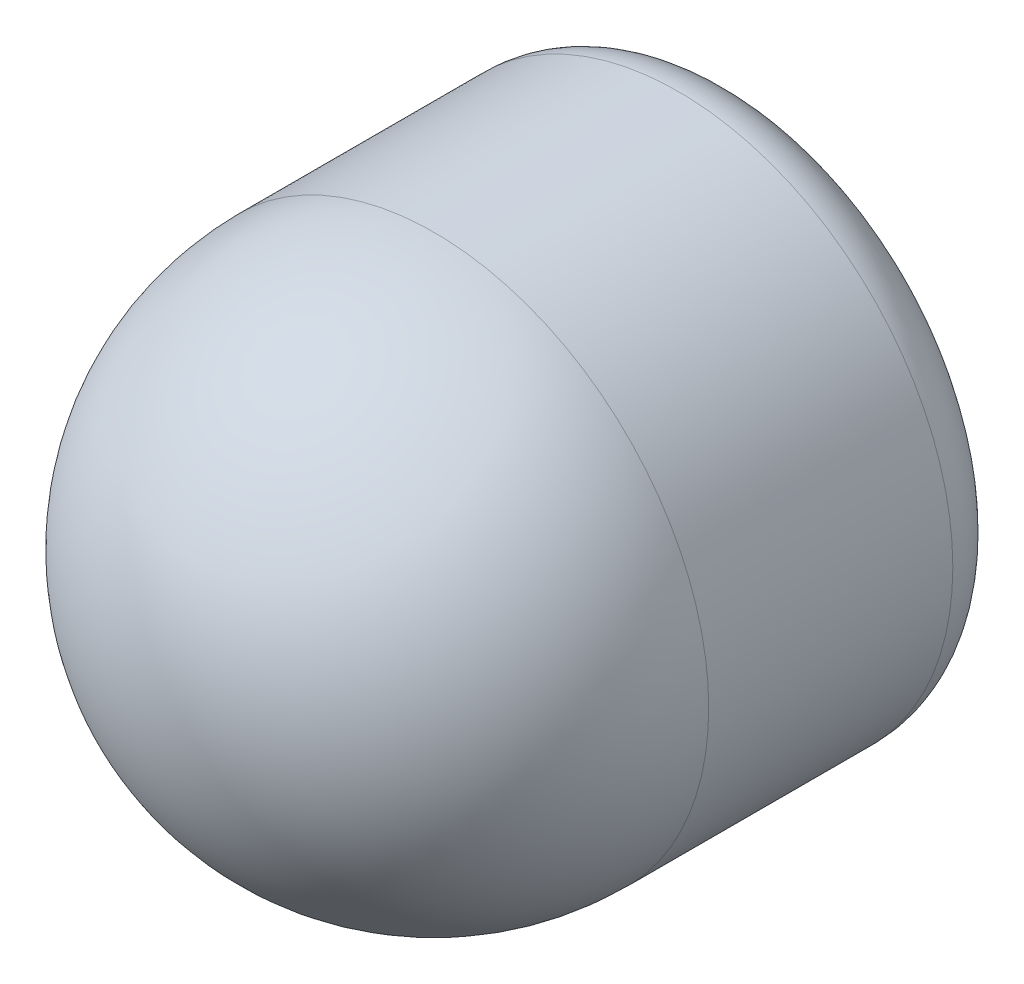
ISO-10303-21;
HEADER;
FILE_DESCRIPTION(('STEP AP214'),'2;1');
FILE_NAME('part.step','',(''),(''),'','','');
FILE_SCHEMA(('AUTOMOTIVE_DESIGN { 1 0 10303 214 1 1 1 1 }'));
ENDSEC;
DATA;
#1=APPLICATION_CONTEXT('core data for automotive mechanical design processes');
#2=APPLICATION_PROTOCOL_DEFINITION('international standard','automotive_design',2000,#1);
#3=PRODUCT_CONTEXT('',#1,'mechanical');
#4=PRODUCT('Part','Part','',(#3));
#5=PRODUCT_RELATED_PRODUCT_CATEGORY('part','',(#4));
#6=PRODUCT_DEFINITION_FORMATION('','',#4);
#7=PRODUCT_DEFINITION_CONTEXT('part definition',#1,'design');
#8=PRODUCT_DEFINITION('design','',#6,#7);
#9=PRODUCT_DEFINITION_SHAPE('','',#8);
#10=(LENGTH_UNIT() NAMED_UNIT(*) SI_UNIT(.MILLI.,.METRE.));
#11=(NAMED_UNIT(*) PLANE_ANGLE_UNIT() SI_UNIT($,.RADIAN.));
#12=(NAMED_UNIT(*) SI_UNIT($,.STERADIAN.) SOLID_ANGLE_UNIT());
#13=UNCERTAINTY_MEASURE_WITH_UNIT(LENGTH_MEASURE(1.E-05),#10,'distance_accuracy_value','');
#14=(GEOMETRIC_REPRESENTATION_CONTEXT(3) GLOBAL_UNCERTAINTY_ASSIGNED_CONTEXT((#13)) GLOBAL_UNIT_ASSIGNED_CONTEXT((#10,
#11,#12)) REPRESENTATION_CONTEXT('',''));
#15=CARTESIAN_POINT('',(0.,0.,0.));
#16=DIRECTION('',(0.,0.,1.));
#17=DIRECTION('',(1.,0.,0.));
#18=AXIS2_PLACEMENT_3D('',#15,#16,#17);
#19=CARTESIAN_POINT('',(0.,0.,-10.));
#20=DIRECTION('',(0.,0.,1.));
#21=DIRECTION('',(1.,0.,0.));
#22=AXIS2_PLACEMENT_3D('',#19,#20,#21);
#23=PLANE('',#22);
#24=DIRECTION('',(0.,-1.,0.));
#25=VECTOR('',#24,1.);
#26=CARTESIAN_POINT('',(-5.25,5.25,-10.));
#27=LINE('',#26,#25);
#28=CARTESIAN_POINT('',(-5.25,4.63006479436303,-10.));
#29=VERTEX_POINT('',#28);
#30=CARTESIAN_POINT('',(-5.25,-4.63006479436303,-10.));
#31=VERTEX_POINT('',#30);
#32=EDGE_CURVE('E245',#29,#31,#27,.T.);
#33=ORIENTED_EDGE('',*,*,#32,.T.);
#34=CARTESIAN_POINT('',(0.,0.,-10.));
#35=DIRECTION('',(0.,0.,1.));
#36=DIRECTION('',(1.,0.,0.));
#37=AXIS2_PLACEMENT_3D('',#34,#35,#36);
#38=CIRCLE('',#37,7.);
#39=EDGE_CURVE('E169',#31,#29,#38,.F.);
#40=ORIENTED_EDGE('',*,*,#39,.T.);
#41=EDGE_LOOP('',(#33,#40));
#42=FACE_BOUND('',#41,.T.);
#43=ADVANCED_FACE('F39',(#42),#23,.F.);
#44=DIRECTION('',(-1.,0.,0.));
#45=VECTOR('',#44,1.);
#46=CARTESIAN_POINT('',(-5.25,5.25,-10.));
#47=LINE('',#46,#45);
#48=CARTESIAN_POINT('',(4.63006479436303,5.25,-10.));
#49=VERTEX_POINT('',#48);
#50=CARTESIAN_POINT('',(-4.63006479436303,5.25,-10.));
#51=VERTEX_POINT('',#50);
#52=EDGE_CURVE('E247',#49,#51,#47,.T.);
#53=ORIENTED_EDGE('',*,*,#52,.T.);
#54=CARTESIAN_POINT('',(0.,0.,-10.));
#55=DIRECTION('',(0.,0.,1.));
#56=DIRECTION('',(1.,0.,0.));
#57=AXIS2_PLACEMENT_3D('',#54,#55,#56);
#58=CIRCLE('',#57,7.);
#59=EDGE_CURVE('E166',#51,#49,#58,.F.);
#60=ORIENTED_EDGE('',*,*,#59,.T.);
#61=EDGE_LOOP('',(#53,#60));
#62=FACE_BOUND('',#61,.T.);
#63=ADVANCED_FACE('F272',(#62),#23,.F.);
#64=DIRECTION('',(0.,1.,0.));
#65=VECTOR('',#64,1.);
#66=CARTESIAN_POINT('',(5.25,5.25,-10.));
#67=LINE('',#66,#65);
#68=CARTESIAN_POINT('',(5.25,-4.63006479436303,-10.));
#69=VERTEX_POINT('',#68);
#70=CARTESIAN_POINT('',(5.25,4.63006479436303,-10.));
#71=VERTEX_POINT('',#70);
#72=EDGE_CURVE('E144',#69,#71,#67,.T.);
#73=ORIENTED_EDGE('',*,*,#72,.T.);
#74=CARTESIAN_POINT('',(0.,0.,-10.));
#75=DIRECTION('',(0.,0.,1.));
#76=DIRECTION('',(1.,0.,0.));
#77=AXIS2_PLACEMENT_3D('',#74,#75,#76);
#78=CIRCLE('',#77,7.);
#79=EDGE_CURVE('E163',#71,#69,#78,.F.);
#80=ORIENTED_EDGE('',*,*,#79,.T.);
#81=EDGE_LOOP('',(#73,#80));
#82=FACE_BOUND('',#81,.T.);
#83=ADVANCED_FACE('F257',(#82),#23,.F.);
#84=CARTESIAN_POINT('',(0.,0.,-10.));
#85=DIRECTION('',(0.,0.,1.));
#86=DIRECTION('',(1.,0.,0.));
#87=AXIS2_PLACEMENT_3D('',#84,#85,#86);
#88=CYLINDRICAL_SURFACE('',#87,9.);
#89=CARTESIAN_POINT('',(0.,0.,-8.));
#90=DIRECTION('',(0.,0.,1.));
#91=DIRECTION('',(1.,0.,0.));
#92=AXIS2_PLACEMENT_3D('',#89,#90,#91);
#93=CIRCLE('',#92,9.);
#94=CARTESIAN_POINT('',(9.,0.,-8.));
#95=VERTEX_POINT('',#94);
#96=EDGE_CURVE('E156',#95,#95,#93,.T.);
#97=ORIENTED_EDGE('',*,*,#96,.T.);
#98=EDGE_LOOP('',(#97));
#99=FACE_BOUND('',#98,.T.);
#100=CARTESIAN_POINT('',(0.,0.,0.));
#101=DIRECTION('',(0.,0.,1.));
#102=DIRECTION('',(1.,0.,0.));
#103=AXIS2_PLACEMENT_3D('',#100,#101,#102);
#104=CIRCLE('',#103,9.);
#105=CARTESIAN_POINT('',(9.,0.,0.));
#106=VERTEX_POINT('',#105);
#107=EDGE_CURVE('E147',#106,#106,#104,.T.);
#108=ORIENTED_EDGE('',*,*,#107,.F.);
#109=EDGE_LOOP('',(#108));
#110=FACE_BOUND('',#109,.T.);
#111=ADVANCED_FACE('F263',(#99,#110),#88,.T.);
#112=DIRECTION('',(1.,0.,0.));
#113=VECTOR('',#112,1.);
#114=CARTESIAN_POINT('',(-5.25,-5.25,-10.));
#115=LINE('',#114,#113);
#116=CARTESIAN_POINT('',(-4.63006479436303,-5.25,-10.));
#117=VERTEX_POINT('',#116);
#118=CARTESIAN_POINT('',(4.63006479436303,-5.25,-10.));
#119=VERTEX_POINT('',#118);
#120=EDGE_CURVE('E119',#117,#119,#115,.T.);
#121=ORIENTED_EDGE('',*,*,#120,.T.);
#122=CARTESIAN_POINT('',(0.,0.,-10.));
#123=DIRECTION('',(0.,0.,1.));
#124=DIRECTION('',(1.,0.,0.));
#125=AXIS2_PLACEMENT_3D('',#122,#123,#124);
#126=CIRCLE('',#125,7.);
#127=EDGE_CURVE('E160',#119,#117,#126,.F.);
#128=ORIENTED_EDGE('',*,*,#127,.T.);
#129=EDGE_LOOP('',(#121,#128));
#130=FACE_BOUND('',#129,.T.);
#131=ADVANCED_FACE('F260',(#130),#23,.F.);
#132=CARTESIAN_POINT('',(0.,0.,0.));
#133=DIRECTION('',(0.,1.,0.));
#134=DIRECTION('',(1.,0.,0.));
#135=AXIS2_PLACEMENT_3D('',#132,#133,#134);
#136=SPHERICAL_SURFACE('',#135,9.);
#137=CARTESIAN_POINT('',(0.,0.,0.));
#138=DIRECTION('',(0.,0.,1.));
#139=DIRECTION('',(1.,0.,0.));
#140=AXIS2_PLACEMENT_3D('',#137,#138,#139);
#141=SPHERICAL_SURFACE('',#140,9.);
#142=ORIENTED_EDGE('',*,*,#107,.T.);
#143=EDGE_LOOP('',(#142));
#144=FACE_BOUND('',#143,.T.);
#145=ADVANCED_FACE('F262',(#144),#141,.T.);
#146=CARTESIAN_POINT('',(5.25,5.25,-10.));
#147=DIRECTION('',(1.,0.,0.));
#148=DIRECTION('',(0.,1.,0.));
#149=AXIS2_PLACEMENT_3D('',#146,#147,#148);
#150=PLANE('',#149);
#151=DIRECTION('',(0.,0.,1.));
#152=VECTOR('',#151,1.);
#153=CARTESIAN_POINT('',(5.25,5.25,-10.));
#154=LINE('',#153,#152);
#155=CARTESIAN_POINT('',(5.25,5.25,-9.95440447052868));
#156=VERTEX_POINT('',#155);
#157=CARTESIAN_POINT('',(5.25,5.25,0.));
#158=VERTEX_POINT('',#157);
#159=EDGE_CURVE('E110',#156,#158,#154,.T.);
#160=ORIENTED_EDGE('',*,*,#159,.F.);
#161=CARTESIAN_POINT('',(5.25,5.25,-9.95440447052868));
#162=CARTESIAN_POINT('',(5.25,5.19870671099318,-9.96228418612201));
#163=CARTESIAN_POINT('',(5.25,5.14725104072652,-9.96907469849296));
#164=CARTESIAN_POINT('',(5.25,5.04418222367752,-9.98057294898351));
#165=CARTESIAN_POINT('',(5.25,4.99256941296827,-9.98528368979809));
#166=CARTESIAN_POINT('',(5.25,4.88921118219327,-9.99273976665063));
#167=CARTESIAN_POINT('',(5.25,4.83746578023225,-9.99548535802112));
#168=CARTESIAN_POINT('',(5.25,4.73383397762555,-9.99911668851927));
#169=CARTESIAN_POINT('',(5.25,4.68194748133006,-9.99999972435228));
#170=CARTESIAN_POINT('',(5.25,4.63006479436303,-10.));
#171=B_SPLINE_CURVE_WITH_KNOTS('',3,(#161,#162,#163,#164,#165,#166,#167,#168,#169,#170),
.UNSPECIFIED.,.F.,.F.,(4,2,2,2,4),(0.,0.15566632437961,0.311107162768348,0.466527801007661,
0.622173860438639),.UNSPECIFIED.);
#172=EDGE_CURVE('E220',#156,#71,#171,.T.);
#173=ORIENTED_EDGE('',*,*,#172,.T.);
#174=ORIENTED_EDGE('',*,*,#72,.F.);
#175=CARTESIAN_POINT('',(5.25,-4.63006479436303,-10.));
#176=CARTESIAN_POINT('',(5.25,-4.68194748133006,-9.99999972435228));
#177=CARTESIAN_POINT('',(5.25,-4.73383397762555,-9.99911668851927));
#178=CARTESIAN_POINT('',(5.25,-4.83746578023225,-9.99548535802112));
#179=CARTESIAN_POINT('',(5.25,-4.88921118219327,-9.99273976665063));
#180=CARTESIAN_POINT('',(5.25,-4.99256941296827,-9.98528368979809));
#181=CARTESIAN_POINT('',(5.25,-5.04418222367752,-9.98057294898351));
#182=CARTESIAN_POINT('',(5.25,-5.14725104072652,-9.96907469849296));
#183=CARTESIAN_POINT('',(5.25,-5.19870671099318,-9.96228418612201));
#184=CARTESIAN_POINT('',(5.25,-5.25,-9.95440447052868));
#185=B_SPLINE_CURVE_WITH_KNOTS('',3,(#175,#176,#177,#178,#179,#180,#181,#182,#183,#184),
.UNSPECIFIED.,.F.,.F.,(4,2,2,2,4),(0.,0.155646059430978,0.311066697670291,0.466507536059029,
0.622173860438639),.UNSPECIFIED.);
#186=CARTESIAN_POINT('',(5.25,-5.25,-9.95440447052868));
#187=VERTEX_POINT('',#186);
#188=EDGE_CURVE('E61',#69,#187,#185,.T.);
#189=ORIENTED_EDGE('',*,*,#188,.T.);
#190=DIRECTION('',(0.,0.,1.));
#191=VECTOR('',#190,1.);
#192=CARTESIAN_POINT('',(5.25,-5.25,-10.));
#193=LINE('',#192,#191);
#194=CARTESIAN_POINT('',(5.25,-5.25,0.));
#195=VERTEX_POINT('',#194);
#196=EDGE_CURVE('E133',#187,#195,#193,.T.);
#197=ORIENTED_EDGE('',*,*,#196,.T.);
#198=DIRECTION('',(0.,1.,0.));
#199=VECTOR('',#198,1.);
#200=CARTESIAN_POINT('',(5.25,5.25,0.));
#201=LINE('',#200,#199);
#202=EDGE_CURVE('E126',#195,#158,#201,.T.);
#203=ORIENTED_EDGE('',*,*,#202,.T.);
#204=EDGE_LOOP('',(#160,#173,#174,#189,#197,#203));
#205=FACE_BOUND('',#204,.T.);
#206=ADVANCED_FACE('F132',(#205),#150,.F.);
#207=CARTESIAN_POINT('',(-5.25,-5.25,-10.));
#208=DIRECTION('',(0.,-1.,0.));
#209=DIRECTION('',(0.,0.,-1.));
#210=AXIS2_PLACEMENT_3D('',#207,#208,#209);
#211=PLANE('',#210);
#212=ORIENTED_EDGE('',*,*,#196,.F.);
#213=CARTESIAN_POINT('',(5.25,-5.25,-9.95440447052868));
#214=CARTESIAN_POINT('',(5.19870671099318,-5.25,-9.96228418612201));
#215=CARTESIAN_POINT('',(5.14725104072652,-5.25,-9.96907469849296));
#216=CARTESIAN_POINT('',(5.04418222367752,-5.25,-9.98057294898351));
#217=CARTESIAN_POINT('',(4.99256941296828,-5.25,-9.98528368979809));
#218=CARTESIAN_POINT('',(4.88921118219327,-5.25,-9.99273976665063));
#219=CARTESIAN_POINT('',(4.83746578023225,-5.25,-9.99548535802112));
#220=CARTESIAN_POINT('',(4.73383397762555,-5.25,-9.99911668851927));
#221=CARTESIAN_POINT('',(4.68194748133006,-5.25,-9.99999972435228));
#222=CARTESIAN_POINT('',(4.63006479436303,-5.25,-10.));
#223=B_SPLINE_CURVE_WITH_KNOTS('',3,(#213,#214,#215,#216,#217,#218,#219,#220,#221,#222),
.UNSPECIFIED.,.F.,.F.,(4,2,2,2,4),(0.,0.15566632437961,0.311107162768348,0.46652780100766,
0.622173860438639),.UNSPECIFIED.);
#224=EDGE_CURVE('E11',#187,#119,#223,.T.);
#225=ORIENTED_EDGE('',*,*,#224,.T.);
#226=ORIENTED_EDGE('',*,*,#120,.F.);
#227=CARTESIAN_POINT('',(-4.63006479436303,-5.25,-10.));
#228=CARTESIAN_POINT('',(-4.68194748133006,-5.25,-9.99999972435228));
#229=CARTESIAN_POINT('',(-4.73383397762555,-5.25,-9.99911668851927));
#230=CARTESIAN_POINT('',(-4.83746578023225,-5.25,-9.99548535802112));
#231=CARTESIAN_POINT('',(-4.88921118219327,-5.25,-9.99273976665063));
#232=CARTESIAN_POINT('',(-4.99256941296827,-5.25,-9.98528368979809));
#233=CARTESIAN_POINT('',(-5.04418222367752,-5.25,-9.98057294898351));
#234=CARTESIAN_POINT('',(-5.14725104072652,-5.25,-9.96907469849296));
#235=CARTESIAN_POINT('',(-5.19870671099317,-5.25,-9.96228418612201));
#236=CARTESIAN_POINT('',(-5.25,-5.25,-9.95440447052868));
#237=B_SPLINE_CURVE_WITH_KNOTS('',3,(#227,#228,#229,#230,#231,#232,#233,#234,#235,#236),
.UNSPECIFIED.,.F.,.F.,(4,2,2,2,4),(0.,0.155646059430978,0.31106669767029,0.466507536059028,
0.622173860438638),.UNSPECIFIED.);
#238=CARTESIAN_POINT('',(-5.25,-5.25,-9.95440447052868));
#239=VERTEX_POINT('',#238);
#240=EDGE_CURVE('E54',#117,#239,#237,.T.);
#241=ORIENTED_EDGE('',*,*,#240,.T.);
#242=DIRECTION('',(0.,0.,1.));
#243=VECTOR('',#242,1.);
#244=CARTESIAN_POINT('',(-5.25,-5.25,-10.));
#245=LINE('',#244,#243);
#246=CARTESIAN_POINT('',(-5.25,-5.25,0.));
#247=VERTEX_POINT('',#246);
#248=EDGE_CURVE('E148',#239,#247,#245,.T.);
#249=ORIENTED_EDGE('',*,*,#248,.T.);
#250=DIRECTION('',(1.,0.,0.));
#251=VECTOR('',#250,1.);
#252=CARTESIAN_POINT('',(-5.25,-5.25,0.));
#253=LINE('',#252,#251);
#254=EDGE_CURVE('E141',#247,#195,#253,.T.);
#255=ORIENTED_EDGE('',*,*,#254,.T.);
#256=EDGE_LOOP('',(#212,#225,#226,#241,#249,#255));
#257=FACE_BOUND('',#256,.T.);
#258=ADVANCED_FACE('F191',(#257),#211,.F.);
#259=CARTESIAN_POINT('',(-5.25,5.25,-10.));
#260=DIRECTION('',(-1.,0.,0.));
#261=DIRECTION('',(0.,-1.,0.));
#262=AXIS2_PLACEMENT_3D('',#259,#260,#261);
#263=PLANE('',#262);
#264=ORIENTED_EDGE('',*,*,#32,.F.);
#265=CARTESIAN_POINT('',(-5.25,4.63006479436303,-10.));
#266=CARTESIAN_POINT('',(-5.25,4.68194748133006,-9.99999972435228));
#267=CARTESIAN_POINT('',(-5.25,4.73383397762555,-9.99911668851927));
#268=CARTESIAN_POINT('',(-5.25,4.83746578023225,-9.99548535802112));
#269=CARTESIAN_POINT('',(-5.25,4.88921118219327,-9.99273976665063));
#270=CARTESIAN_POINT('',(-5.25,4.99256941296827,-9.98528368979809));
#271=CARTESIAN_POINT('',(-5.25,5.04418222367752,-9.98057294898351));
#272=CARTESIAN_POINT('',(-5.25,5.14725104072652,-9.96907469849296));
#273=CARTESIAN_POINT('',(-5.25,5.19870671099318,-9.96228418612201));
#274=CARTESIAN_POINT('',(-5.25,5.25,-9.95440447052868));
#275=B_SPLINE_CURVE_WITH_KNOTS('',3,(#265,#266,#267,#268,#269,#270,#271,#272,#273,#274),
.UNSPECIFIED.,.F.,.F.,(4,2,2,2,4),(0.,0.155646059430978,0.311066697670291,0.466507536059029,
0.622173860438639),.UNSPECIFIED.);
#276=CARTESIAN_POINT('',(-5.25,5.25,-9.95440447052868));
#277=VERTEX_POINT('',#276);
#278=EDGE_CURVE('E181',#29,#277,#275,.T.);
#279=ORIENTED_EDGE('',*,*,#278,.T.);
#280=DIRECTION('',(0.,0.,1.));
#281=VECTOR('',#280,1.);
#282=CARTESIAN_POINT('',(-5.25,5.25,-10.));
#283=LINE('',#282,#281);
#284=CARTESIAN_POINT('',(-5.25,5.25,0.));
#285=VERTEX_POINT('',#284);
#286=EDGE_CURVE('E118',#277,#285,#283,.T.);
#287=ORIENTED_EDGE('',*,*,#286,.T.);
#288=DIRECTION('',(0.,-1.,0.));
#289=VECTOR('',#288,1.);
#290=CARTESIAN_POINT('',(-5.25,5.25,0.));
#291=LINE('',#290,#289);
#292=EDGE_CURVE('E129',#285,#247,#291,.T.);
#293=ORIENTED_EDGE('',*,*,#292,.T.);
#294=ORIENTED_EDGE('',*,*,#248,.F.);
#295=CARTESIAN_POINT('',(-5.25,-5.25,-9.95440447052868));
#296=CARTESIAN_POINT('',(-5.25,-5.19870671099318,-9.96228418612201));
#297=CARTESIAN_POINT('',(-5.25,-5.14725104072652,-9.96907469849296));
#298=CARTESIAN_POINT('',(-5.25,-5.04418222367752,-9.98057294898351));
#299=CARTESIAN_POINT('',(-5.25,-4.99256941296828,-9.98528368979809));
#300=CARTESIAN_POINT('',(-5.25,-4.88921118219327,-9.99273976665063));
#301=CARTESIAN_POINT('',(-5.25,-4.83746578023225,-9.99548535802112));
#302=CARTESIAN_POINT('',(-5.25,-4.73383397762555,-9.99911668851927));
#303=CARTESIAN_POINT('',(-5.25,-4.68194748133006,-9.99999972435228));
#304=CARTESIAN_POINT('',(-5.25,-4.63006479436303,-10.));
#305=B_SPLINE_CURVE_WITH_KNOTS('',3,(#295,#296,#297,#298,#299,#300,#301,#302,#303,#304),
.UNSPECIFIED.,.F.,.F.,(4,2,2,2,4),(0.,0.15566632437961,0.311107162768347,0.466527801007659,
0.622173860438638),.UNSPECIFIED.);
#306=EDGE_CURVE('E173',#239,#31,#305,.T.);
#307=ORIENTED_EDGE('',*,*,#306,.T.);
#308=EDGE_LOOP('',(#264,#279,#287,#293,#294,#307));
#309=FACE_BOUND('',#308,.T.);
#310=ADVANCED_FACE('F187',(#309),#263,.F.);
#311=CARTESIAN_POINT('',(-5.25,5.25,-10.));
#312=DIRECTION('',(0.,1.,0.));
#313=DIRECTION('',(0.,0.,1.));
#314=AXIS2_PLACEMENT_3D('',#311,#312,#313);
#315=PLANE('',#314);
#316=ORIENTED_EDGE('',*,*,#286,.F.);
#317=CARTESIAN_POINT('',(-5.25,5.25,-9.95440447052868));
#318=CARTESIAN_POINT('',(-5.19870671099318,5.25,-9.96228418612201));
#319=CARTESIAN_POINT('',(-5.14725104072652,5.25,-9.96907469849296));
#320=CARTESIAN_POINT('',(-5.04418222367752,5.25,-9.98057294898351));
#321=CARTESIAN_POINT('',(-4.99256941296827,5.25,-9.98528368979809));
#322=CARTESIAN_POINT('',(-4.88921118219327,5.25,-9.99273976665063));
#323=CARTESIAN_POINT('',(-4.83746578023225,5.25,-9.99548535802112));
#324=CARTESIAN_POINT('',(-4.73383397762555,5.25,-9.99911668851927));
#325=CARTESIAN_POINT('',(-4.68194748133006,5.25,-9.99999972435228));
#326=CARTESIAN_POINT('',(-4.63006479436303,5.25,-10.));
#327=B_SPLINE_CURVE_WITH_KNOTS('',3,(#317,#318,#319,#320,#321,#322,#323,#324,#325,#326),
.UNSPECIFIED.,.F.,.F.,(4,2,2,2,4),(0.,0.15566632437961,0.311107162768348,0.466527801007661,
0.622173860438639),.UNSPECIFIED.);
#328=EDGE_CURVE('E207',#277,#51,#327,.T.);
#329=ORIENTED_EDGE('',*,*,#328,.T.);
#330=ORIENTED_EDGE('',*,*,#52,.F.);
#331=CARTESIAN_POINT('',(4.63006479436303,5.25,-10.));
#332=CARTESIAN_POINT('',(4.68194748133006,5.25,-9.99999972435228));
#333=CARTESIAN_POINT('',(4.73383397762555,5.25,-9.99911668851927));
#334=CARTESIAN_POINT('',(4.83746578023225,5.25,-9.99548535802112));
#335=CARTESIAN_POINT('',(4.88921118219327,5.25,-9.99273976665063));
#336=CARTESIAN_POINT('',(4.99256941296827,5.25,-9.98528368979809));
#337=CARTESIAN_POINT('',(5.04418222367752,5.25,-9.98057294898351));
#338=CARTESIAN_POINT('',(5.14725104072652,5.25,-9.96907469849296));
#339=CARTESIAN_POINT('',(5.19870671099318,5.25,-9.96228418612201));
#340=CARTESIAN_POINT('',(5.25,5.25,-9.95440447052868));
#341=B_SPLINE_CURVE_WITH_KNOTS('',3,(#331,#332,#333,#334,#335,#336,#337,#338,#339,#340),
.UNSPECIFIED.,.F.,.F.,(4,2,2,2,4),(0.,0.155646059430978,0.311066697670291,0.466507536059029,
0.622173860438639),.UNSPECIFIED.);
#342=EDGE_CURVE('E69',#49,#156,#341,.T.);
#343=ORIENTED_EDGE('',*,*,#342,.T.);
#344=ORIENTED_EDGE('',*,*,#159,.T.);
#345=DIRECTION('',(-1.,0.,0.));
#346=VECTOR('',#345,1.);
#347=CARTESIAN_POINT('',(-5.25,5.25,0.));
#348=LINE('',#347,#346);
#349=EDGE_CURVE('E114',#158,#285,#348,.T.);
#350=ORIENTED_EDGE('',*,*,#349,.T.);
#351=EDGE_LOOP('',(#316,#329,#330,#343,#344,#350));
#352=FACE_BOUND('',#351,.T.);
#353=ADVANCED_FACE('F113',(#352),#315,.F.);
#354=CARTESIAN_POINT('',(0.,0.,0.));
#355=DIRECTION('',(0.,0.,1.));
#356=DIRECTION('',(1.,0.,0.));
#357=AXIS2_PLACEMENT_3D('',#354,#355,#356);
#358=PLANE('',#357);
#359=ORIENTED_EDGE('',*,*,#202,.F.);
#360=ORIENTED_EDGE('',*,*,#254,.F.);
#361=ORIENTED_EDGE('',*,*,#292,.F.);
#362=ORIENTED_EDGE('',*,*,#349,.F.);
#363=EDGE_LOOP('',(#359,#360,#361,#362));
#364=FACE_BOUND('',#363,.T.);
#365=ADVANCED_FACE('F124',(#364),#358,.F.);
#366=CARTESIAN_POINT('',(0.,0.,-8.));
#367=DIRECTION('',(0.,0.,1.));
#368=DIRECTION('',(1.,0.,0.));
#369=AXIS2_PLACEMENT_3D('',#366,#367,#368);
#370=TOROIDAL_SURFACE('',#369,7.,2.);
#371=ORIENTED_EDGE('',*,*,#278,.F.);
#372=ORIENTED_EDGE('',*,*,#39,.F.);
#373=ORIENTED_EDGE('',*,*,#306,.F.);
#374=ORIENTED_EDGE('',*,*,#240,.F.);
#375=ORIENTED_EDGE('',*,*,#127,.F.);
#376=ORIENTED_EDGE('',*,*,#224,.F.);
#377=ORIENTED_EDGE('',*,*,#188,.F.);
#378=ORIENTED_EDGE('',*,*,#79,.F.);
#379=ORIENTED_EDGE('',*,*,#172,.F.);
#380=ORIENTED_EDGE('',*,*,#342,.F.);
#381=ORIENTED_EDGE('',*,*,#59,.F.);
#382=ORIENTED_EDGE('',*,*,#328,.F.);
#383=EDGE_LOOP('',(#371,#372,#373,#374,#375,#376,#377,#378,#379,#380,#381,#382));
#384=FACE_BOUND('',#383,.T.);
#385=ORIENTED_EDGE('',*,*,#96,.F.);
#386=EDGE_LOOP('',(#385));
#387=FACE_BOUND('',#386,.T.);
#388=ADVANCED_FACE('F41',(#384,#387),#370,.T.);
#389=CLOSED_SHELL('',(#43,#63,#83,#111,#131,#145,#206,#258,#310,#353,#365,#388));
#390=MANIFOLD_SOLID_BREP('B2',#389);
#391=ADVANCED_BREP_SHAPE_REPRESENTATION('',(#18,#390),#14);
#392=SHAPE_DEFINITION_REPRESENTATION(#9,#391);
ENDSEC;
END-ISO-10303-21;
